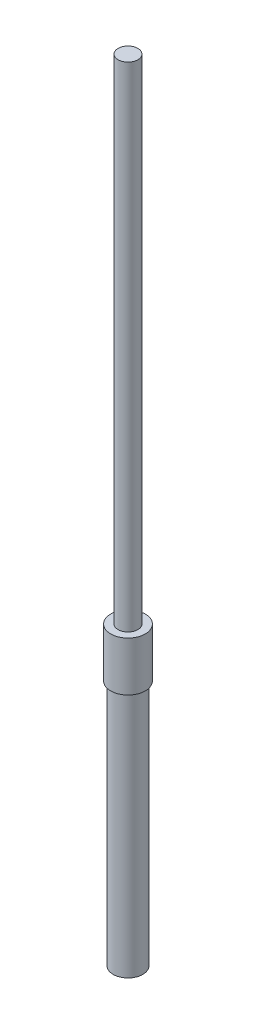
ISO-10303-21;
HEADER;
FILE_DESCRIPTION(('STEP AP214'),'2;1');
FILE_NAME('part.step','',(''),(''),'','','');
FILE_SCHEMA(('AUTOMOTIVE_DESIGN { 1 0 10303 214 1 1 1 1 }'));
ENDSEC;
DATA;
#1=APPLICATION_CONTEXT('core data for automotive mechanical design processes');
#2=APPLICATION_PROTOCOL_DEFINITION('international standard','automotive_design',2000,#1);
#3=PRODUCT_CONTEXT('',#1,'mechanical');
#4=PRODUCT('Part','Part','',(#3));
#5=PRODUCT_RELATED_PRODUCT_CATEGORY('part','',(#4));
#6=PRODUCT_DEFINITION_FORMATION('','',#4);
#7=PRODUCT_DEFINITION_CONTEXT('part definition',#1,'design');
#8=PRODUCT_DEFINITION('design','',#6,#7);
#9=PRODUCT_DEFINITION_SHAPE('','',#8);
#10=(LENGTH_UNIT() NAMED_UNIT(*) SI_UNIT(.MILLI.,.METRE.));
#11=(NAMED_UNIT(*) PLANE_ANGLE_UNIT() SI_UNIT($,.RADIAN.));
#12=(NAMED_UNIT(*) SI_UNIT($,.STERADIAN.) SOLID_ANGLE_UNIT());
#13=UNCERTAINTY_MEASURE_WITH_UNIT(LENGTH_MEASURE(1.E-05),#10,'distance_accuracy_value','');
#14=(GEOMETRIC_REPRESENTATION_CONTEXT(3) GLOBAL_UNCERTAINTY_ASSIGNED_CONTEXT((#13)) GLOBAL_UNIT_ASSIGNED_CONTEXT((#10,
#11,#12)) REPRESENTATION_CONTEXT('',''));
#15=CARTESIAN_POINT('',(0.,0.,0.));
#16=DIRECTION('',(0.,0.,1.));
#17=DIRECTION('',(1.,0.,0.));
#18=AXIS2_PLACEMENT_3D('',#15,#16,#17);
#19=CARTESIAN_POINT('',(0.,50.,0.));
#20=DIRECTION('',(0.,-1.,0.));
#21=DIRECTION('',(0.,0.,-1.));
#22=AXIS2_PLACEMENT_3D('',#19,#20,#21);
#23=CYLINDRICAL_SURFACE('',#22,3.);
#24=CARTESIAN_POINT('',(0.,50.,0.));
#25=DIRECTION('',(0.,1.,0.));
#26=DIRECTION('',(0.,0.,1.));
#27=AXIS2_PLACEMENT_3D('',#24,#25,#26);
#28=CIRCLE('',#27,3.);
#29=CARTESIAN_POINT('',(0.,50.,3.));
#30=VERTEX_POINT('',#29);
#31=EDGE_CURVE('E54',#30,#30,#28,.T.);
#32=ORIENTED_EDGE('',*,*,#31,.F.);
#33=EDGE_LOOP('',(#32));
#34=FACE_BOUND('',#33,.T.);
#35=CARTESIAN_POINT('',(0.,0.,0.));
#36=DIRECTION('',(0.,1.,0.));
#37=DIRECTION('',(0.,0.,1.));
#38=AXIS2_PLACEMENT_3D('',#35,#36,#37);
#39=CIRCLE('',#38,3.);
#40=CARTESIAN_POINT('',(0.,0.,3.));
#41=VERTEX_POINT('',#40);
#42=EDGE_CURVE('E49',#41,#41,#39,.T.);
#43=ORIENTED_EDGE('',*,*,#42,.T.);
#44=EDGE_LOOP('',(#43));
#45=FACE_BOUND('',#44,.T.);
#46=ADVANCED_FACE('F50',(#34,#45),#23,.T.);
#47=CARTESIAN_POINT('',(0.,0.,0.));
#48=DIRECTION('',(0.,1.,0.));
#49=DIRECTION('',(0.,0.,1.));
#50=AXIS2_PLACEMENT_3D('',#47,#48,#49);
#51=PLANE('',#50);
#52=ORIENTED_EDGE('',*,*,#42,.F.);
#53=EDGE_LOOP('',(#52));
#54=FACE_BOUND('',#53,.T.);
#55=ADVANCED_FACE('F91',(#54),#51,.F.);
#56=CARTESIAN_POINT('',(0.,60.,0.));
#57=DIRECTION('',(0.,-1.,0.));
#58=DIRECTION('',(0.,0.,-1.));
#59=AXIS2_PLACEMENT_3D('',#56,#57,#58);
#60=CYLINDRICAL_SURFACE('',#59,3.5);
#61=CARTESIAN_POINT('',(0.,60.,0.));
#62=DIRECTION('',(0.,1.,0.));
#63=DIRECTION('',(0.,0.,1.));
#64=AXIS2_PLACEMENT_3D('',#61,#62,#63);
#65=CIRCLE('',#64,3.5);
#66=CARTESIAN_POINT('',(0.,60.,3.5));
#67=VERTEX_POINT('',#66);
#68=EDGE_CURVE('E63',#67,#67,#65,.T.);
#69=ORIENTED_EDGE('',*,*,#68,.F.);
#70=EDGE_LOOP('',(#69));
#71=FACE_BOUND('',#70,.T.);
#72=CARTESIAN_POINT('',(0.,50.,0.));
#73=DIRECTION('',(0.,1.,0.));
#74=DIRECTION('',(0.,0.,1.));
#75=AXIS2_PLACEMENT_3D('',#72,#73,#74);
#76=CIRCLE('',#75,3.5);
#77=CARTESIAN_POINT('',(0.,50.,3.5));
#78=VERTEX_POINT('',#77);
#79=EDGE_CURVE('E69',#78,#78,#76,.T.);
#80=ORIENTED_EDGE('',*,*,#79,.T.);
#81=EDGE_LOOP('',(#80));
#82=FACE_BOUND('',#81,.T.);
#83=ADVANCED_FACE('F98',(#71,#82),#60,.T.);
#84=CARTESIAN_POINT('',(0.,60.,0.));
#85=DIRECTION('',(0.,1.,0.));
#86=DIRECTION('',(0.,0.,1.));
#87=AXIS2_PLACEMENT_3D('',#84,#85,#86);
#88=PLANE('',#87);
#89=CARTESIAN_POINT('',(0.,60.,0.));
#90=DIRECTION('',(0.,1.,0.));
#91=DIRECTION('',(0.,0.,1.));
#92=AXIS2_PLACEMENT_3D('',#89,#90,#91);
#93=CIRCLE('',#92,2.);
#94=CARTESIAN_POINT('',(0.,60.,2.));
#95=VERTEX_POINT('',#94);
#96=EDGE_CURVE('E10',#95,#95,#93,.T.);
#97=ORIENTED_EDGE('',*,*,#96,.F.);
#98=EDGE_LOOP('',(#97));
#99=FACE_BOUND('',#98,.T.);
#100=ORIENTED_EDGE('',*,*,#68,.T.);
#101=EDGE_LOOP('',(#100));
#102=FACE_BOUND('',#101,.T.);
#103=ADVANCED_FACE('F86',(#99,#102),#88,.T.);
#104=CARTESIAN_POINT('',(0.,50.,0.));
#105=DIRECTION('',(0.,1.,0.));
#106=DIRECTION('',(0.,0.,1.));
#107=AXIS2_PLACEMENT_3D('',#104,#105,#106);
#108=PLANE('',#107);
#109=ORIENTED_EDGE('',*,*,#31,.T.);
#110=EDGE_LOOP('',(#109));
#111=FACE_BOUND('',#110,.T.);
#112=ORIENTED_EDGE('',*,*,#79,.F.);
#113=EDGE_LOOP('',(#112));
#114=FACE_BOUND('',#113,.T.);
#115=ADVANCED_FACE('F81',(#111,#114),#108,.F.);
#116=CARTESIAN_POINT('',(0.,160.,0.));
#117=DIRECTION('',(0.,-1.,0.));
#118=DIRECTION('',(0.,0.,-1.));
#119=AXIS2_PLACEMENT_3D('',#116,#117,#118);
#120=CYLINDRICAL_SURFACE('',#119,2.);
#121=CARTESIAN_POINT('',(0.,160.,0.));
#122=DIRECTION('',(0.,1.,0.));
#123=DIRECTION('',(0.,0.,1.));
#124=AXIS2_PLACEMENT_3D('',#121,#122,#123);
#125=CIRCLE('',#124,2.);
#126=CARTESIAN_POINT('',(0.,160.,2.));
#127=VERTEX_POINT('',#126);
#128=EDGE_CURVE('E62',#127,#127,#125,.T.);
#129=ORIENTED_EDGE('',*,*,#128,.F.);
#130=EDGE_LOOP('',(#129));
#131=FACE_BOUND('',#130,.T.);
#132=ORIENTED_EDGE('',*,*,#96,.T.);
#133=EDGE_LOOP('',(#132));
#134=FACE_BOUND('',#133,.T.);
#135=ADVANCED_FACE('F78',(#131,#134),#120,.T.);
#136=CARTESIAN_POINT('',(0.,160.,0.));
#137=DIRECTION('',(0.,1.,0.));
#138=DIRECTION('',(0.,0.,1.));
#139=AXIS2_PLACEMENT_3D('',#136,#137,#138);
#140=PLANE('',#139);
#141=ORIENTED_EDGE('',*,*,#128,.T.);
#142=EDGE_LOOP('',(#141));
#143=FACE_BOUND('',#142,.T.);
#144=ADVANCED_FACE('F80',(#143),#140,.T.);
#145=CLOSED_SHELL('',(#46,#55,#83,#103,#115,#135,#144));
#146=MANIFOLD_SOLID_BREP('B2',#145);
#147=ADVANCED_BREP_SHAPE_REPRESENTATION('',(#18,#146),#14);
#148=SHAPE_DEFINITION_REPRESENTATION(#9,#147);
ENDSEC;
END-ISO-10303-21;
